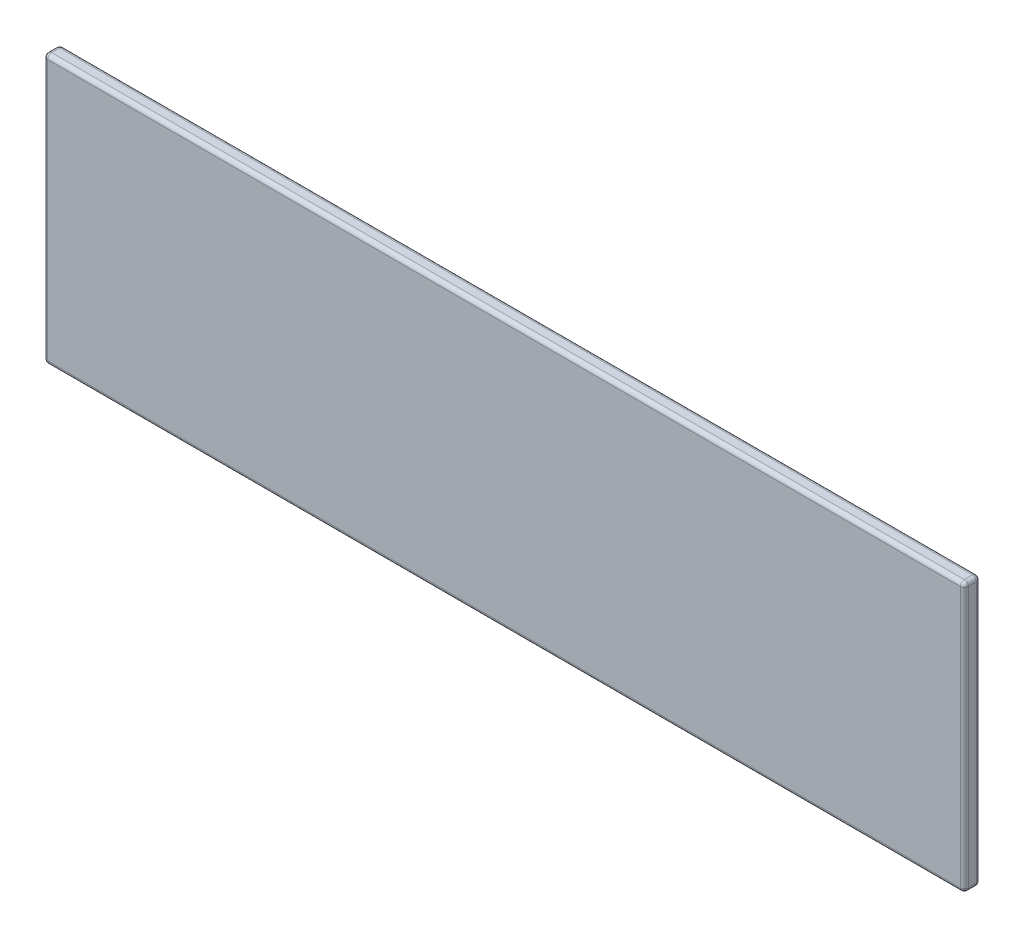
ISO-10303-21;
HEADER;
FILE_DESCRIPTION(('STEP AP214'),'2;1');
FILE_NAME('part.step','',(''),(''),'','','');
FILE_SCHEMA(('AUTOMOTIVE_DESIGN { 1 0 10303 214 1 1 1 1 }'));
ENDSEC;
DATA;
#1=APPLICATION_CONTEXT('core data for automotive mechanical design processes');
#2=APPLICATION_PROTOCOL_DEFINITION('international standard','automotive_design',2000,#1);
#3=PRODUCT_CONTEXT('',#1,'mechanical');
#4=PRODUCT('Part','Part','',(#3));
#5=PRODUCT_RELATED_PRODUCT_CATEGORY('part','',(#4));
#6=PRODUCT_DEFINITION_FORMATION('','',#4);
#7=PRODUCT_DEFINITION_CONTEXT('part definition',#1,'design');
#8=PRODUCT_DEFINITION('design','',#6,#7);
#9=PRODUCT_DEFINITION_SHAPE('','',#8);
#10=(LENGTH_UNIT() NAMED_UNIT(*) SI_UNIT(.MILLI.,.METRE.));
#11=(NAMED_UNIT(*) PLANE_ANGLE_UNIT() SI_UNIT($,.RADIAN.));
#12=(NAMED_UNIT(*) SI_UNIT($,.STERADIAN.) SOLID_ANGLE_UNIT());
#13=UNCERTAINTY_MEASURE_WITH_UNIT(LENGTH_MEASURE(1.E-05),#10,'distance_accuracy_value','');
#14=(GEOMETRIC_REPRESENTATION_CONTEXT(3) GLOBAL_UNCERTAINTY_ASSIGNED_CONTEXT((#13)) GLOBAL_UNIT_ASSIGNED_CONTEXT((#10,
#11,#12)) REPRESENTATION_CONTEXT('',''));
#15=CARTESIAN_POINT('',(0.,0.,0.));
#16=DIRECTION('',(0.,0.,1.));
#17=DIRECTION('',(1.,0.,0.));
#18=AXIS2_PLACEMENT_3D('',#15,#16,#17);
#19=CARTESIAN_POINT('',(57.35,-16.75,2.));
#20=DIRECTION('',(-1.,0.,0.));
#21=DIRECTION('',(0.,0.,1.));
#22=AXIS2_PLACEMENT_3D('',#19,#20,#21);
#23=PLANE('',#22);
#24=DIRECTION('',(0.,1.,0.));
#25=VECTOR('',#24,1.);
#26=CARTESIAN_POINT('',(57.35,-16.75,1.5));
#27=LINE('',#26,#25);
#28=CARTESIAN_POINT('',(57.35,16.25,1.5));
#29=VERTEX_POINT('',#28);
#30=CARTESIAN_POINT('',(57.35,-16.25,1.5));
#31=VERTEX_POINT('',#30);
#32=EDGE_CURVE('E42',#29,#31,#27,.F.);
#33=ORIENTED_EDGE('',*,*,#32,.T.);
#34=DIRECTION('',(0.,0.,-1.));
#35=VECTOR('',#34,1.);
#36=CARTESIAN_POINT('',(57.35,-16.25,2.));
#37=LINE('',#36,#35);
#38=CARTESIAN_POINT('',(57.35,-16.25,0.5));
#39=VERTEX_POINT('',#38);
#40=EDGE_CURVE('E11',#31,#39,#37,.T.);
#41=ORIENTED_EDGE('',*,*,#40,.T.);
#42=DIRECTION('',(0.,1.,0.));
#43=VECTOR('',#42,1.);
#44=CARTESIAN_POINT('',(57.35,16.75,0.5));
#45=LINE('',#44,#43);
#46=CARTESIAN_POINT('',(57.35,16.25,0.5));
#47=VERTEX_POINT('',#46);
#48=EDGE_CURVE('E194',#39,#47,#45,.T.);
#49=ORIENTED_EDGE('',*,*,#48,.T.);
#50=DIRECTION('',(0.,0.,-1.));
#51=VECTOR('',#50,1.);
#52=CARTESIAN_POINT('',(57.35,16.25,2.));
#53=LINE('',#52,#51);
#54=EDGE_CURVE('E53',#47,#29,#53,.F.);
#55=ORIENTED_EDGE('',*,*,#54,.T.);
#56=EDGE_LOOP('',(#33,#41,#49,#55));
#57=FACE_BOUND('',#56,.T.);
#58=ADVANCED_FACE('F33',(#57),#23,.F.);
#59=CARTESIAN_POINT('',(-57.35,16.75,2.));
#60=DIRECTION('',(0.,-1.,0.));
#61=DIRECTION('',(0.,0.,-1.));
#62=AXIS2_PLACEMENT_3D('',#59,#60,#61);
#63=PLANE('',#62);
#64=DIRECTION('',(0.,0.,-1.));
#65=VECTOR('',#64,1.);
#66=CARTESIAN_POINT('',(-56.85,16.75,2.));
#67=LINE('',#66,#65);
#68=CARTESIAN_POINT('',(-56.85,16.75,0.5));
#69=VERTEX_POINT('',#68);
#70=CARTESIAN_POINT('',(-56.85,16.75,1.5));
#71=VERTEX_POINT('',#70);
#72=EDGE_CURVE('E189',#69,#71,#67,.F.);
#73=ORIENTED_EDGE('',*,*,#72,.T.);
#74=DIRECTION('',(-1.,0.,0.));
#75=VECTOR('',#74,1.);
#76=CARTESIAN_POINT('',(-57.35,16.75,1.5));
#77=LINE('',#76,#75);
#78=CARTESIAN_POINT('',(56.85,16.75,1.5));
#79=VERTEX_POINT('',#78);
#80=EDGE_CURVE('E191',#71,#79,#77,.F.);
#81=ORIENTED_EDGE('',*,*,#80,.T.);
#82=DIRECTION('',(0.,0.,-1.));
#83=VECTOR('',#82,1.);
#84=CARTESIAN_POINT('',(56.85,16.75,2.));
#85=LINE('',#84,#83);
#86=CARTESIAN_POINT('',(56.85,16.75,0.5));
#87=VERTEX_POINT('',#86);
#88=EDGE_CURVE('E185',#79,#87,#85,.T.);
#89=ORIENTED_EDGE('',*,*,#88,.T.);
#90=DIRECTION('',(-1.,0.,0.));
#91=VECTOR('',#90,1.);
#92=CARTESIAN_POINT('',(-57.35,16.75,0.5));
#93=LINE('',#92,#91);
#94=EDGE_CURVE('E187',#87,#69,#93,.T.);
#95=ORIENTED_EDGE('',*,*,#94,.T.);
#96=EDGE_LOOP('',(#73,#81,#89,#95));
#97=FACE_BOUND('',#96,.T.);
#98=ADVANCED_FACE('F278',(#97),#63,.F.);
#99=CARTESIAN_POINT('',(-57.35,-16.75,2.));
#100=DIRECTION('',(1.,0.,0.));
#101=DIRECTION('',(0.,0.,-1.));
#102=AXIS2_PLACEMENT_3D('',#99,#100,#101);
#103=PLANE('',#102);
#104=DIRECTION('',(0.,0.,-1.));
#105=VECTOR('',#104,1.);
#106=CARTESIAN_POINT('',(-57.35,-16.25,2.));
#107=LINE('',#106,#105);
#108=CARTESIAN_POINT('',(-57.35,-16.25,0.5));
#109=VERTEX_POINT('',#108);
#110=CARTESIAN_POINT('',(-57.35,-16.25,1.5));
#111=VERTEX_POINT('',#110);
#112=EDGE_CURVE('E180',#109,#111,#107,.F.);
#113=ORIENTED_EDGE('',*,*,#112,.T.);
#114=DIRECTION('',(0.,-1.,0.));
#115=VECTOR('',#114,1.);
#116=CARTESIAN_POINT('',(-57.35,-16.75,1.5));
#117=LINE('',#116,#115);
#118=CARTESIAN_POINT('',(-57.35,16.25,1.5));
#119=VERTEX_POINT('',#118);
#120=EDGE_CURVE('E182',#111,#119,#117,.F.);
#121=ORIENTED_EDGE('',*,*,#120,.T.);
#122=DIRECTION('',(0.,0.,-1.));
#123=VECTOR('',#122,1.);
#124=CARTESIAN_POINT('',(-57.35,16.25,2.));
#125=LINE('',#124,#123);
#126=CARTESIAN_POINT('',(-57.35,16.25,0.5));
#127=VERTEX_POINT('',#126);
#128=EDGE_CURVE('E176',#119,#127,#125,.T.);
#129=ORIENTED_EDGE('',*,*,#128,.T.);
#130=DIRECTION('',(0.,-1.,0.));
#131=VECTOR('',#130,1.);
#132=CARTESIAN_POINT('',(-57.35,-16.75,0.5));
#133=LINE('',#132,#131);
#134=EDGE_CURVE('E178',#127,#109,#133,.T.);
#135=ORIENTED_EDGE('',*,*,#134,.T.);
#136=EDGE_LOOP('',(#113,#121,#129,#135));
#137=FACE_BOUND('',#136,.T.);
#138=ADVANCED_FACE('F269',(#137),#103,.F.);
#139=CARTESIAN_POINT('',(-57.35,-16.75,2.));
#140=DIRECTION('',(0.,1.,0.));
#141=DIRECTION('',(0.,0.,1.));
#142=AXIS2_PLACEMENT_3D('',#139,#140,#141);
#143=PLANE('',#142);
#144=DIRECTION('',(1.,0.,0.));
#145=VECTOR('',#144,1.);
#146=CARTESIAN_POINT('',(-57.35,-16.75,1.5));
#147=LINE('',#146,#145);
#148=CARTESIAN_POINT('',(56.85,-16.75,1.5));
#149=VERTEX_POINT('',#148);
#150=CARTESIAN_POINT('',(-56.85,-16.75,1.5));
#151=VERTEX_POINT('',#150);
#152=EDGE_CURVE('E129',#149,#151,#147,.F.);
#153=ORIENTED_EDGE('',*,*,#152,.T.);
#154=DIRECTION('',(0.,0.,-1.));
#155=VECTOR('',#154,1.);
#156=CARTESIAN_POINT('',(-56.85,-16.75,2.));
#157=LINE('',#156,#155);
#158=CARTESIAN_POINT('',(-56.85,-16.75,0.5));
#159=VERTEX_POINT('',#158);
#160=EDGE_CURVE('E165',#151,#159,#157,.T.);
#161=ORIENTED_EDGE('',*,*,#160,.T.);
#162=DIRECTION('',(1.,0.,0.));
#163=VECTOR('',#162,1.);
#164=CARTESIAN_POINT('',(57.35,-16.75,0.5));
#165=LINE('',#164,#163);
#166=CARTESIAN_POINT('',(56.85,-16.75,0.5));
#167=VERTEX_POINT('',#166);
#168=EDGE_CURVE('E158',#159,#167,#165,.T.);
#169=ORIENTED_EDGE('',*,*,#168,.T.);
#170=DIRECTION('',(0.,0.,-1.));
#171=VECTOR('',#170,1.);
#172=CARTESIAN_POINT('',(56.85,-16.75,2.));
#173=LINE('',#172,#171);
#174=EDGE_CURVE('E156',#167,#149,#173,.F.);
#175=ORIENTED_EDGE('',*,*,#174,.T.);
#176=EDGE_LOOP('',(#153,#161,#169,#175));
#177=FACE_BOUND('',#176,.T.);
#178=ADVANCED_FACE('F356',(#177),#143,.F.);
#179=CARTESIAN_POINT('',(0.,0.,2.));
#180=DIRECTION('',(0.,0.,-1.));
#181=DIRECTION('',(-1.,0.,0.));
#182=AXIS2_PLACEMENT_3D('',#179,#180,#181);
#183=PLANE('',#182);
#184=DIRECTION('',(0.,-1.,0.));
#185=VECTOR('',#184,1.);
#186=CARTESIAN_POINT('',(-56.85,0.,2.));
#187=LINE('',#186,#185);
#188=CARTESIAN_POINT('',(-56.85,16.25,2.));
#189=VERTEX_POINT('',#188);
#190=CARTESIAN_POINT('',(-56.85,-16.25,2.));
#191=VERTEX_POINT('',#190);
#192=EDGE_CURVE('E154',#189,#191,#187,.T.);
#193=ORIENTED_EDGE('',*,*,#192,.T.);
#194=DIRECTION('',(1.,0.,0.));
#195=VECTOR('',#194,1.);
#196=CARTESIAN_POINT('',(0.,-16.25,2.));
#197=LINE('',#196,#195);
#198=CARTESIAN_POINT('',(56.85,-16.25,2.));
#199=VERTEX_POINT('',#198);
#200=EDGE_CURVE('E127',#191,#199,#197,.T.);
#201=ORIENTED_EDGE('',*,*,#200,.T.);
#202=DIRECTION('',(0.,1.,0.));
#203=VECTOR('',#202,1.);
#204=CARTESIAN_POINT('',(56.85,0.,2.));
#205=LINE('',#204,#203);
#206=CARTESIAN_POINT('',(56.85,16.25,2.));
#207=VERTEX_POINT('',#206);
#208=EDGE_CURVE('E144',#199,#207,#205,.T.);
#209=ORIENTED_EDGE('',*,*,#208,.T.);
#210=DIRECTION('',(-1.,0.,0.));
#211=VECTOR('',#210,1.);
#212=CARTESIAN_POINT('',(0.,16.25,2.));
#213=LINE('',#212,#211);
#214=EDGE_CURVE('E150',#207,#189,#213,.T.);
#215=ORIENTED_EDGE('',*,*,#214,.T.);
#216=EDGE_LOOP('',(#193,#201,#209,#215));
#217=FACE_BOUND('',#216,.T.);
#218=ADVANCED_FACE('F152',(#217),#183,.F.);
#219=CARTESIAN_POINT('',(0.,0.,0.));
#220=DIRECTION('',(0.,0.,-1.));
#221=DIRECTION('',(-1.,0.,0.));
#222=AXIS2_PLACEMENT_3D('',#219,#220,#221);
#223=PLANE('',#222);
#224=DIRECTION('',(0.,1.,0.));
#225=VECTOR('',#224,1.);
#226=CARTESIAN_POINT('',(56.85,-16.75,0.));
#227=LINE('',#226,#225);
#228=CARTESIAN_POINT('',(56.85,16.25,0.));
#229=VERTEX_POINT('',#228);
#230=CARTESIAN_POINT('',(56.85,-16.25,0.));
#231=VERTEX_POINT('',#230);
#232=EDGE_CURVE('E167',#229,#231,#227,.F.);
#233=ORIENTED_EDGE('',*,*,#232,.T.);
#234=DIRECTION('',(1.,0.,0.));
#235=VECTOR('',#234,1.);
#236=CARTESIAN_POINT('',(-57.35,-16.25,0.));
#237=LINE('',#236,#235);
#238=CARTESIAN_POINT('',(-56.85,-16.25,0.));
#239=VERTEX_POINT('',#238);
#240=EDGE_CURVE('E173',#231,#239,#237,.F.);
#241=ORIENTED_EDGE('',*,*,#240,.T.);
#242=DIRECTION('',(0.,-1.,0.));
#243=VECTOR('',#242,1.);
#244=CARTESIAN_POINT('',(-56.85,16.75,0.));
#245=LINE('',#244,#243);
#246=CARTESIAN_POINT('',(-56.85,16.25,0.));
#247=VERTEX_POINT('',#246);
#248=EDGE_CURVE('E171',#239,#247,#245,.F.);
#249=ORIENTED_EDGE('',*,*,#248,.T.);
#250=DIRECTION('',(-1.,0.,0.));
#251=VECTOR('',#250,1.);
#252=CARTESIAN_POINT('',(57.35,16.25,0.));
#253=LINE('',#252,#251);
#254=EDGE_CURVE('E169',#247,#229,#253,.F.);
#255=ORIENTED_EDGE('',*,*,#254,.T.);
#256=EDGE_LOOP('',(#233,#241,#249,#255));
#257=FACE_BOUND('',#256,.T.);
#258=ADVANCED_FACE('F296',(#257),#223,.T.);
#259=CARTESIAN_POINT('',(-57.35,16.25,0.5));
#260=DIRECTION('',(1.,0.,0.));
#261=DIRECTION('',(0.,0.,-1.));
#262=AXIS2_PLACEMENT_3D('',#259,#260,#261);
#263=CYLINDRICAL_SURFACE('',#262,0.5);
#264=CARTESIAN_POINT('',(-56.85,16.25,0.5));
#265=DIRECTION('',(-1.,0.,0.));
#266=DIRECTION('',(0.,0.,1.));
#267=AXIS2_PLACEMENT_3D('',#264,#265,#266);
#268=CIRCLE('',#267,0.5);
#269=EDGE_CURVE('E37',#69,#247,#268,.T.);
#270=ORIENTED_EDGE('',*,*,#269,.F.);
#271=ORIENTED_EDGE('',*,*,#94,.F.);
#272=CARTESIAN_POINT('',(56.85,16.25,0.5));
#273=DIRECTION('',(1.,0.,0.));
#274=DIRECTION('',(0.,0.,-1.));
#275=AXIS2_PLACEMENT_3D('',#272,#273,#274);
#276=CIRCLE('',#275,0.5);
#277=EDGE_CURVE('E246',#229,#87,#276,.T.);
#278=ORIENTED_EDGE('',*,*,#277,.F.);
#279=ORIENTED_EDGE('',*,*,#254,.F.);
#280=EDGE_LOOP('',(#270,#271,#278,#279));
#281=FACE_BOUND('',#280,.T.);
#282=ADVANCED_FACE('F35',(#281),#263,.T.);
#283=CARTESIAN_POINT('',(-56.85,16.25,0.5));
#284=DIRECTION('',(0.,0.,1.));
#285=DIRECTION('',(1.,0.,0.));
#286=AXIS2_PLACEMENT_3D('',#283,#284,#285);
#287=SPHERICAL_SURFACE('',#286,0.5);
#288=CARTESIAN_POINT('',(-56.85,16.25,0.5));
#289=DIRECTION('',(0.,0.,-1.));
#290=DIRECTION('',(-1.,0.,0.));
#291=AXIS2_PLACEMENT_3D('',#288,#289,#290);
#292=CIRCLE('',#291,0.5);
#293=EDGE_CURVE('E241',#69,#127,#292,.F.);
#294=ORIENTED_EDGE('',*,*,#293,.F.);
#295=ORIENTED_EDGE('',*,*,#269,.T.);
#296=CARTESIAN_POINT('',(-56.85,16.25,0.5));
#297=DIRECTION('',(0.,1.,0.));
#298=DIRECTION('',(0.,0.,1.));
#299=AXIS2_PLACEMENT_3D('',#296,#297,#298);
#300=CIRCLE('',#299,0.5);
#301=EDGE_CURVE('E244',#127,#247,#300,.F.);
#302=ORIENTED_EDGE('',*,*,#301,.F.);
#303=EDGE_LOOP('',(#294,#295,#302));
#304=FACE_BOUND('',#303,.T.);
#305=ADVANCED_FACE('F257',(#304),#287,.T.);
#306=CARTESIAN_POINT('',(56.85,16.25,0.5));
#307=DIRECTION('',(0.,0.,1.));
#308=DIRECTION('',(1.,0.,0.));
#309=AXIS2_PLACEMENT_3D('',#306,#307,#308);
#310=SPHERICAL_SURFACE('',#309,0.5);
#311=CARTESIAN_POINT('',(56.85,16.25,0.5));
#312=DIRECTION('',(0.,1.,0.));
#313=DIRECTION('',(0.,0.,1.));
#314=AXIS2_PLACEMENT_3D('',#311,#312,#313);
#315=CIRCLE('',#314,0.5);
#316=EDGE_CURVE('E235',#229,#47,#315,.F.);
#317=ORIENTED_EDGE('',*,*,#316,.F.);
#318=ORIENTED_EDGE('',*,*,#277,.T.);
#319=CARTESIAN_POINT('',(56.85,16.25,0.5));
#320=DIRECTION('',(0.,0.,-1.));
#321=DIRECTION('',(-1.,0.,0.));
#322=AXIS2_PLACEMENT_3D('',#319,#320,#321);
#323=CIRCLE('',#322,0.5);
#324=EDGE_CURVE('E238',#47,#87,#323,.F.);
#325=ORIENTED_EDGE('',*,*,#324,.F.);
#326=EDGE_LOOP('',(#317,#318,#325));
#327=FACE_BOUND('',#326,.T.);
#328=ADVANCED_FACE('F289',(#327),#310,.T.);
#329=CARTESIAN_POINT('',(-56.85,-16.75,0.5));
#330=DIRECTION('',(0.,1.,0.));
#331=DIRECTION('',(0.,0.,1.));
#332=AXIS2_PLACEMENT_3D('',#329,#330,#331);
#333=CYLINDRICAL_SURFACE('',#332,0.5);
#334=ORIENTED_EDGE('',*,*,#301,.T.);
#335=ORIENTED_EDGE('',*,*,#248,.F.);
#336=CARTESIAN_POINT('',(-56.85,-16.25,0.5));
#337=DIRECTION('',(0.,-1.,0.));
#338=DIRECTION('',(0.,0.,-1.));
#339=AXIS2_PLACEMENT_3D('',#336,#337,#338);
#340=CIRCLE('',#339,0.5);
#341=EDGE_CURVE('E230',#109,#239,#340,.T.);
#342=ORIENTED_EDGE('',*,*,#341,.F.);
#343=ORIENTED_EDGE('',*,*,#134,.F.);
#344=EDGE_LOOP('',(#334,#335,#342,#343));
#345=FACE_BOUND('',#344,.T.);
#346=ADVANCED_FACE('F265',(#345),#333,.T.);
#347=CARTESIAN_POINT('',(-56.85,16.25,2.));
#348=DIRECTION('',(0.,0.,-1.));
#349=DIRECTION('',(-1.,0.,0.));
#350=AXIS2_PLACEMENT_3D('',#347,#348,#349);
#351=CYLINDRICAL_SURFACE('',#350,0.5);
#352=ORIENTED_EDGE('',*,*,#293,.T.);
#353=ORIENTED_EDGE('',*,*,#128,.F.);
#354=CARTESIAN_POINT('',(-56.85,16.25,1.5));
#355=DIRECTION('',(0.,0.,1.));
#356=DIRECTION('',(1.,0.,0.));
#357=AXIS2_PLACEMENT_3D('',#354,#355,#356);
#358=CIRCLE('',#357,0.5);
#359=EDGE_CURVE('E227',#71,#119,#358,.T.);
#360=ORIENTED_EDGE('',*,*,#359,.F.);
#361=ORIENTED_EDGE('',*,*,#72,.F.);
#362=EDGE_LOOP('',(#352,#353,#360,#361));
#363=FACE_BOUND('',#362,.T.);
#364=ADVANCED_FACE('F275',(#363),#351,.T.);
#365=CARTESIAN_POINT('',(0.,16.25,1.5));
#366=DIRECTION('',(-1.,0.,0.));
#367=DIRECTION('',(0.,0.,1.));
#368=AXIS2_PLACEMENT_3D('',#365,#366,#367);
#369=CYLINDRICAL_SURFACE('',#368,0.5);
#370=CARTESIAN_POINT('',(56.85,16.25,1.5));
#371=DIRECTION('',(1.,0.,0.));
#372=DIRECTION('',(0.,0.,-1.));
#373=AXIS2_PLACEMENT_3D('',#370,#371,#372);
#374=CIRCLE('',#373,0.5);
#375=EDGE_CURVE('E221',#79,#207,#374,.T.);
#376=ORIENTED_EDGE('',*,*,#375,.F.);
#377=ORIENTED_EDGE('',*,*,#80,.F.);
#378=CARTESIAN_POINT('',(-56.85,16.25,1.5));
#379=DIRECTION('',(-1.,0.,0.));
#380=DIRECTION('',(0.,0.,1.));
#381=AXIS2_PLACEMENT_3D('',#378,#379,#380);
#382=CIRCLE('',#381,0.5);
#383=EDGE_CURVE('E224',#189,#71,#382,.T.);
#384=ORIENTED_EDGE('',*,*,#383,.F.);
#385=ORIENTED_EDGE('',*,*,#214,.F.);
#386=EDGE_LOOP('',(#376,#377,#384,#385));
#387=FACE_BOUND('',#386,.T.);
#388=ADVANCED_FACE('F282',(#387),#369,.T.);
#389=CARTESIAN_POINT('',(56.85,16.25,2.));
#390=DIRECTION('',(0.,0.,-1.));
#391=DIRECTION('',(-1.,0.,0.));
#392=AXIS2_PLACEMENT_3D('',#389,#390,#391);
#393=CYLINDRICAL_SURFACE('',#392,0.5);
#394=ORIENTED_EDGE('',*,*,#324,.T.);
#395=ORIENTED_EDGE('',*,*,#88,.F.);
#396=CARTESIAN_POINT('',(56.85,16.25,1.5));
#397=DIRECTION('',(0.,0.,1.));
#398=DIRECTION('',(1.,0.,0.));
#399=AXIS2_PLACEMENT_3D('',#396,#397,#398);
#400=CIRCLE('',#399,0.5);
#401=EDGE_CURVE('E219',#29,#79,#400,.T.);
#402=ORIENTED_EDGE('',*,*,#401,.F.);
#403=ORIENTED_EDGE('',*,*,#54,.F.);
#404=EDGE_LOOP('',(#394,#395,#402,#403));
#405=FACE_BOUND('',#404,.T.);
#406=ADVANCED_FACE('F287',(#405),#393,.T.);
#407=CARTESIAN_POINT('',(56.85,-16.75,0.5));
#408=DIRECTION('',(0.,-1.,0.));
#409=DIRECTION('',(0.,0.,-1.));
#410=AXIS2_PLACEMENT_3D('',#407,#408,#409);
#411=CYLINDRICAL_SURFACE('',#410,0.5);
#412=ORIENTED_EDGE('',*,*,#316,.T.);
#413=ORIENTED_EDGE('',*,*,#48,.F.);
#414=CARTESIAN_POINT('',(56.85,-16.25,0.5));
#415=DIRECTION('',(0.,-1.,0.));
#416=DIRECTION('',(0.,0.,-1.));
#417=AXIS2_PLACEMENT_3D('',#414,#415,#416);
#418=CIRCLE('',#417,0.5);
#419=EDGE_CURVE('E216',#231,#39,#418,.T.);
#420=ORIENTED_EDGE('',*,*,#419,.F.);
#421=ORIENTED_EDGE('',*,*,#232,.F.);
#422=EDGE_LOOP('',(#412,#413,#420,#421));
#423=FACE_BOUND('',#422,.T.);
#424=ADVANCED_FACE('F293',(#423),#411,.T.);
#425=CARTESIAN_POINT('',(-57.35,-16.25,0.5));
#426=DIRECTION('',(-1.,0.,0.));
#427=DIRECTION('',(0.,0.,1.));
#428=AXIS2_PLACEMENT_3D('',#425,#426,#427);
#429=CYLINDRICAL_SURFACE('',#428,0.5);
#430=CARTESIAN_POINT('',(-56.85,-16.25,0.5));
#431=DIRECTION('',(-1.,0.,0.));
#432=DIRECTION('',(0.,0.,1.));
#433=AXIS2_PLACEMENT_3D('',#430,#431,#432);
#434=CIRCLE('',#433,0.5);
#435=EDGE_CURVE('E232',#239,#159,#434,.T.);
#436=ORIENTED_EDGE('',*,*,#435,.F.);
#437=ORIENTED_EDGE('',*,*,#240,.F.);
#438=CARTESIAN_POINT('',(56.85,-16.25,0.5));
#439=DIRECTION('',(1.,0.,0.));
#440=DIRECTION('',(0.,0.,-1.));
#441=AXIS2_PLACEMENT_3D('',#438,#439,#440);
#442=CIRCLE('',#441,0.5);
#443=EDGE_CURVE('E213',#167,#231,#442,.T.);
#444=ORIENTED_EDGE('',*,*,#443,.F.);
#445=ORIENTED_EDGE('',*,*,#168,.F.);
#446=EDGE_LOOP('',(#436,#437,#444,#445));
#447=FACE_BOUND('',#446,.T.);
#448=ADVANCED_FACE('F300',(#447),#429,.T.);
#449=CARTESIAN_POINT('',(-56.85,-16.25,0.5));
#450=DIRECTION('',(0.,0.,1.));
#451=DIRECTION('',(1.,0.,0.));
#452=AXIS2_PLACEMENT_3D('',#449,#450,#451);
#453=SPHERICAL_SURFACE('',#452,0.5);
#454=ORIENTED_EDGE('',*,*,#341,.T.);
#455=ORIENTED_EDGE('',*,*,#435,.T.);
#456=CARTESIAN_POINT('',(-56.85,-16.25,0.5));
#457=DIRECTION('',(0.,0.,-1.));
#458=DIRECTION('',(-1.,0.,0.));
#459=AXIS2_PLACEMENT_3D('',#456,#457,#458);
#460=CIRCLE('',#459,0.5);
#461=EDGE_CURVE('E210',#109,#159,#460,.F.);
#462=ORIENTED_EDGE('',*,*,#461,.F.);
#463=EDGE_LOOP('',(#454,#455,#462));
#464=FACE_BOUND('',#463,.T.);
#465=ADVANCED_FACE('F304',(#464),#453,.T.);
#466=CARTESIAN_POINT('',(-56.85,16.25,1.5));
#467=DIRECTION('',(0.,0.,1.));
#468=DIRECTION('',(1.,0.,0.));
#469=AXIS2_PLACEMENT_3D('',#466,#467,#468);
#470=SPHERICAL_SURFACE('',#469,0.5);
#471=ORIENTED_EDGE('',*,*,#383,.T.);
#472=ORIENTED_EDGE('',*,*,#359,.T.);
#473=CARTESIAN_POINT('',(-56.85,16.25,1.5));
#474=DIRECTION('',(0.,1.,0.));
#475=DIRECTION('',(0.,0.,1.));
#476=AXIS2_PLACEMENT_3D('',#473,#474,#475);
#477=CIRCLE('',#476,0.5);
#478=EDGE_CURVE('E208',#189,#119,#477,.F.);
#479=ORIENTED_EDGE('',*,*,#478,.F.);
#480=EDGE_LOOP('',(#471,#472,#479));
#481=FACE_BOUND('',#480,.T.);
#482=ADVANCED_FACE('F315',(#481),#470,.T.);
#483=CARTESIAN_POINT('',(56.85,16.25,1.5));
#484=DIRECTION('',(0.,0.,1.));
#485=DIRECTION('',(1.,0.,0.));
#486=AXIS2_PLACEMENT_3D('',#483,#484,#485);
#487=SPHERICAL_SURFACE('',#486,0.5);
#488=ORIENTED_EDGE('',*,*,#401,.T.);
#489=ORIENTED_EDGE('',*,*,#375,.T.);
#490=CARTESIAN_POINT('',(56.85,16.25,1.5));
#491=DIRECTION('',(0.,1.,0.));
#492=DIRECTION('',(0.,0.,1.));
#493=AXIS2_PLACEMENT_3D('',#490,#491,#492);
#494=CIRCLE('',#493,0.5);
#495=EDGE_CURVE('E147',#29,#207,#494,.F.);
#496=ORIENTED_EDGE('',*,*,#495,.F.);
#497=EDGE_LOOP('',(#488,#489,#496));
#498=FACE_BOUND('',#497,.T.);
#499=ADVANCED_FACE('F317',(#498),#487,.T.);
#500=CARTESIAN_POINT('',(56.85,-16.25,0.5));
#501=DIRECTION('',(0.,0.,1.));
#502=DIRECTION('',(1.,0.,0.));
#503=AXIS2_PLACEMENT_3D('',#500,#501,#502);
#504=SPHERICAL_SURFACE('',#503,0.5);
#505=ORIENTED_EDGE('',*,*,#443,.T.);
#506=ORIENTED_EDGE('',*,*,#419,.T.);
#507=CARTESIAN_POINT('',(56.85,-16.25,0.5));
#508=DIRECTION('',(0.,0.,-1.));
#509=DIRECTION('',(-1.,0.,0.));
#510=AXIS2_PLACEMENT_3D('',#507,#508,#509);
#511=CIRCLE('',#510,0.5);
#512=EDGE_CURVE('E205',#167,#39,#511,.F.);
#513=ORIENTED_EDGE('',*,*,#512,.F.);
#514=EDGE_LOOP('',(#505,#506,#513));
#515=FACE_BOUND('',#514,.T.);
#516=ADVANCED_FACE('F323',(#515),#504,.T.);
#517=CARTESIAN_POINT('',(-56.85,-16.25,2.));
#518=DIRECTION('',(0.,0.,-1.));
#519=DIRECTION('',(-1.,0.,0.));
#520=AXIS2_PLACEMENT_3D('',#517,#518,#519);
#521=CYLINDRICAL_SURFACE('',#520,0.5);
#522=ORIENTED_EDGE('',*,*,#461,.T.);
#523=ORIENTED_EDGE('',*,*,#160,.F.);
#524=CARTESIAN_POINT('',(-56.85,-16.25,1.5));
#525=DIRECTION('',(0.,0.,1.));
#526=DIRECTION('',(1.,0.,0.));
#527=AXIS2_PLACEMENT_3D('',#524,#525,#526);
#528=CIRCLE('',#527,0.5);
#529=EDGE_CURVE('E202',#111,#151,#528,.T.);
#530=ORIENTED_EDGE('',*,*,#529,.F.);
#531=ORIENTED_EDGE('',*,*,#112,.F.);
#532=EDGE_LOOP('',(#522,#523,#530,#531));
#533=FACE_BOUND('',#532,.T.);
#534=ADVANCED_FACE('F307',(#533),#521,.T.);
#535=CARTESIAN_POINT('',(-56.85,0.,1.5));
#536=DIRECTION('',(0.,-1.,0.));
#537=DIRECTION('',(0.,0.,-1.));
#538=AXIS2_PLACEMENT_3D('',#535,#536,#537);
#539=CYLINDRICAL_SURFACE('',#538,0.5);
#540=ORIENTED_EDGE('',*,*,#478,.T.);
#541=ORIENTED_EDGE('',*,*,#120,.F.);
#542=CARTESIAN_POINT('',(-56.85,-16.25,1.5));
#543=DIRECTION('',(0.,-1.,0.));
#544=DIRECTION('',(0.,0.,-1.));
#545=AXIS2_PLACEMENT_3D('',#542,#543,#544);
#546=CIRCLE('',#545,0.5);
#547=EDGE_CURVE('E141',#191,#111,#546,.T.);
#548=ORIENTED_EDGE('',*,*,#547,.F.);
#549=ORIENTED_EDGE('',*,*,#192,.F.);
#550=EDGE_LOOP('',(#540,#541,#548,#549));
#551=FACE_BOUND('',#550,.T.);
#552=ADVANCED_FACE('F313',(#551),#539,.T.);
#553=CARTESIAN_POINT('',(56.85,0.,1.5));
#554=DIRECTION('',(0.,1.,0.));
#555=DIRECTION('',(0.,0.,1.));
#556=AXIS2_PLACEMENT_3D('',#553,#554,#555);
#557=CYLINDRICAL_SURFACE('',#556,0.5);
#558=ORIENTED_EDGE('',*,*,#495,.T.);
#559=ORIENTED_EDGE('',*,*,#208,.F.);
#560=CARTESIAN_POINT('',(56.85,-16.25,1.5));
#561=DIRECTION('',(0.,-1.,0.));
#562=DIRECTION('',(0.,0.,-1.));
#563=AXIS2_PLACEMENT_3D('',#560,#561,#562);
#564=CIRCLE('',#563,0.5);
#565=EDGE_CURVE('E135',#31,#199,#564,.T.);
#566=ORIENTED_EDGE('',*,*,#565,.F.);
#567=ORIENTED_EDGE('',*,*,#32,.F.);
#568=EDGE_LOOP('',(#558,#559,#566,#567));
#569=FACE_BOUND('',#568,.T.);
#570=ADVANCED_FACE('F145',(#569),#557,.T.);
#571=CARTESIAN_POINT('',(56.85,-16.25,2.));
#572=DIRECTION('',(0.,0.,-1.));
#573=DIRECTION('',(-1.,0.,0.));
#574=AXIS2_PLACEMENT_3D('',#571,#572,#573);
#575=CYLINDRICAL_SURFACE('',#574,0.5);
#576=ORIENTED_EDGE('',*,*,#512,.T.);
#577=ORIENTED_EDGE('',*,*,#40,.F.);
#578=CARTESIAN_POINT('',(56.85,-16.25,1.5));
#579=DIRECTION('',(0.,0.,1.));
#580=DIRECTION('',(1.,0.,0.));
#581=AXIS2_PLACEMENT_3D('',#578,#579,#580);
#582=CIRCLE('',#581,0.5);
#583=EDGE_CURVE('E139',#149,#31,#582,.T.);
#584=ORIENTED_EDGE('',*,*,#583,.F.);
#585=ORIENTED_EDGE('',*,*,#174,.F.);
#586=EDGE_LOOP('',(#576,#577,#584,#585));
#587=FACE_BOUND('',#586,.T.);
#588=ADVANCED_FACE('F340',(#587),#575,.T.);
#589=CARTESIAN_POINT('',(-56.85,-16.25,1.5));
#590=DIRECTION('',(0.,0.,1.));
#591=DIRECTION('',(1.,0.,0.));
#592=AXIS2_PLACEMENT_3D('',#589,#590,#591);
#593=SPHERICAL_SURFACE('',#592,0.5);
#594=ORIENTED_EDGE('',*,*,#547,.T.);
#595=ORIENTED_EDGE('',*,*,#529,.T.);
#596=CARTESIAN_POINT('',(-56.85,-16.25,1.5));
#597=DIRECTION('',(-1.,0.,0.));
#598=DIRECTION('',(0.,0.,1.));
#599=AXIS2_PLACEMENT_3D('',#596,#597,#598);
#600=CIRCLE('',#599,0.5);
#601=EDGE_CURVE('E132',#191,#151,#600,.F.);
#602=ORIENTED_EDGE('',*,*,#601,.F.);
#603=EDGE_LOOP('',(#594,#595,#602));
#604=FACE_BOUND('',#603,.T.);
#605=ADVANCED_FACE('F311',(#604),#593,.T.);
#606=CARTESIAN_POINT('',(56.85,-16.25,1.5));
#607=DIRECTION('',(0.,0.,1.));
#608=DIRECTION('',(1.,0.,0.));
#609=AXIS2_PLACEMENT_3D('',#606,#607,#608);
#610=SPHERICAL_SURFACE('',#609,0.5);
#611=ORIENTED_EDGE('',*,*,#583,.T.);
#612=ORIENTED_EDGE('',*,*,#565,.T.);
#613=CARTESIAN_POINT('',(56.85,-16.25,1.5));
#614=DIRECTION('',(1.,0.,0.));
#615=DIRECTION('',(0.,0.,-1.));
#616=AXIS2_PLACEMENT_3D('',#613,#614,#615);
#617=CIRCLE('',#616,0.5);
#618=EDGE_CURVE('E123',#149,#199,#617,.F.);
#619=ORIENTED_EDGE('',*,*,#618,.F.);
#620=EDGE_LOOP('',(#611,#612,#619));
#621=FACE_BOUND('',#620,.T.);
#622=ADVANCED_FACE('F137',(#621),#610,.T.);
#623=CARTESIAN_POINT('',(0.,-16.25,1.5));
#624=DIRECTION('',(1.,0.,0.));
#625=DIRECTION('',(0.,0.,-1.));
#626=AXIS2_PLACEMENT_3D('',#623,#624,#625);
#627=CYLINDRICAL_SURFACE('',#626,0.5);
#628=ORIENTED_EDGE('',*,*,#601,.T.);
#629=ORIENTED_EDGE('',*,*,#152,.F.);
#630=ORIENTED_EDGE('',*,*,#618,.T.);
#631=ORIENTED_EDGE('',*,*,#200,.F.);
#632=EDGE_LOOP('',(#628,#629,#630,#631));
#633=FACE_BOUND('',#632,.T.);
#634=ADVANCED_FACE('F125',(#633),#627,.T.);
#635=CLOSED_SHELL('',(#58,#98,#138,#178,#218,#258,#282,#305,#328,#346,#364,#388,#406,#424,#448,
#465,#482,#499,#516,#534,#552,#570,#588,#605,#622,#634));
#636=MANIFOLD_SOLID_BREP('B2',#635);
#637=ADVANCED_BREP_SHAPE_REPRESENTATION('',(#18,#636),#14);
#638=SHAPE_DEFINITION_REPRESENTATION(#9,#637);
ENDSEC;
END-ISO-10303-21;
